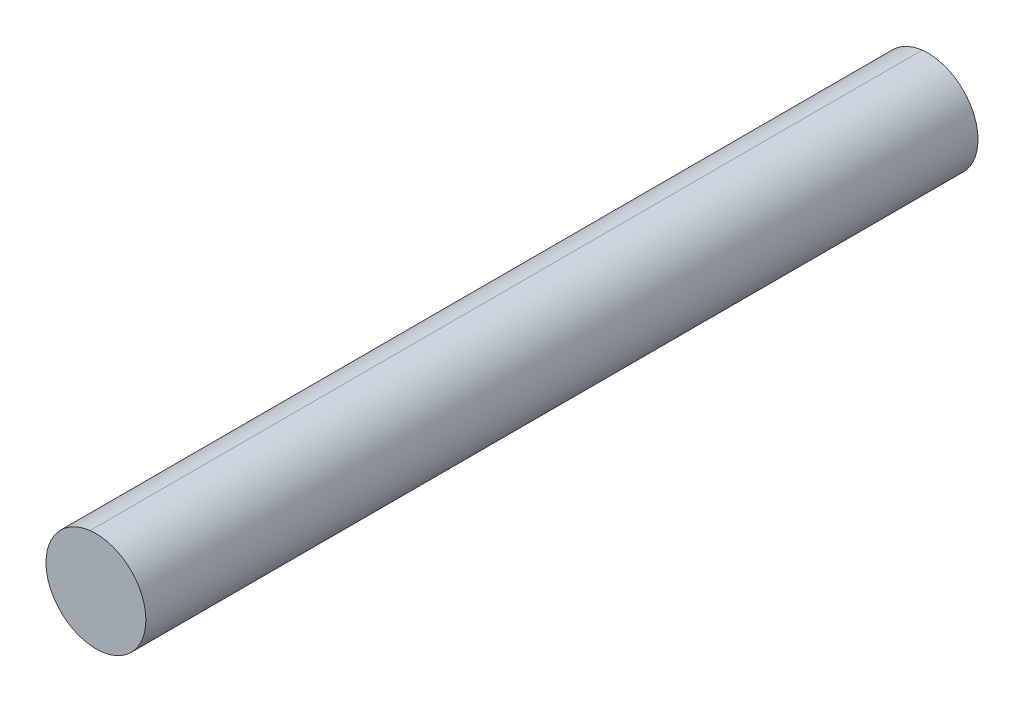
ISO-10303-21;
HEADER;
FILE_DESCRIPTION(('STEP AP214'),'2;1');
FILE_NAME('part.step','',(''),(''),'','','');
FILE_SCHEMA(('AUTOMOTIVE_DESIGN { 1 0 10303 214 1 1 1 1 }'));
ENDSEC;
DATA;
#1=APPLICATION_CONTEXT('core data for automotive mechanical design processes');
#2=APPLICATION_PROTOCOL_DEFINITION('international standard','automotive_design',2000,#1);
#3=PRODUCT_CONTEXT('',#1,'mechanical');
#4=PRODUCT('Part','Part','',(#3));
#5=PRODUCT_RELATED_PRODUCT_CATEGORY('part','',(#4));
#6=PRODUCT_DEFINITION_FORMATION('','',#4);
#7=PRODUCT_DEFINITION_CONTEXT('part definition',#1,'design');
#8=PRODUCT_DEFINITION('design','',#6,#7);
#9=PRODUCT_DEFINITION_SHAPE('','',#8);
#10=(LENGTH_UNIT() NAMED_UNIT(*) SI_UNIT(.MILLI.,.METRE.));
#11=(NAMED_UNIT(*) PLANE_ANGLE_UNIT() SI_UNIT($,.RADIAN.));
#12=(NAMED_UNIT(*) SI_UNIT($,.STERADIAN.) SOLID_ANGLE_UNIT());
#13=UNCERTAINTY_MEASURE_WITH_UNIT(LENGTH_MEASURE(1.E-05),#10,'distance_accuracy_value','');
#14=(GEOMETRIC_REPRESENTATION_CONTEXT(3) GLOBAL_UNCERTAINTY_ASSIGNED_CONTEXT((#13)) GLOBAL_UNIT_ASSIGNED_CONTEXT((#10,
#11,#12)) REPRESENTATION_CONTEXT('',''));
#15=CARTESIAN_POINT('',(0.,0.,0.));
#16=DIRECTION('',(0.,0.,1.));
#17=DIRECTION('',(1.,0.,0.));
#18=AXIS2_PLACEMENT_3D('',#15,#16,#17);
#19=CARTESIAN_POINT('',(-1.50424744913924,-1.51311042144572,24.999985));
#20=CARTESIAN_POINT('',(-1.50424744913924,1.51735191246717,24.999985));
#21=CARTESIAN_POINT('',(1.50454946776159,-1.51311042144572,24.999985));
#22=CARTESIAN_POINT('',(1.50454946776159,1.51735191246717,24.999985));
#23=(BOUNDED_SURFACE() B_SPLINE_SURFACE(1,1,((#19,#20),(#21,#22)),.UNSPECIFIED.,.F.,.F.,
.F.) B_SPLINE_SURFACE_WITH_KNOTS((2,2),(2,2),(0.145602545046179,3.15439946194701),
(0.136703064072907,3.1671653979858),
.UNSPECIFIED.) GEOMETRIC_REPRESENTATION_ITEM() RATIONAL_B_SPLINE_SURFACE(((1.,1.),(1.,1.))) REPRESENTATION_ITEM('') SURFACE());
#24=CARTESIAN_POINT('',(0.091572809386774,-1.49720219762763,24.999985));
#25=CARTESIAN_POINT('',(0.045829145032609,-1.5,24.999985));
#26=CARTESIAN_POINT('',(0.,-1.5,24.999985));
#27=CARTESIAN_POINT('',(-1.5,-1.5,24.999985));
#28=CARTESIAN_POINT('',(-1.5,0.,24.999985));
#29=(BOUNDED_CURVE() B_SPLINE_CURVE(2,(#24,#25,#26,#27,#28),.UNSPECIFIED.,.F.,
.F.) B_SPLINE_CURVE_WITH_KNOTS((3,2,3),(0.739332962222494,0.75,1.),
.UNSPECIFIED.) CURVE() GEOMETRIC_REPRESENTATION_ITEM() RATIONAL_B_SPLINE_CURVE((0.976072041631465,
0.987502787880567,1.,0.707106781186548,1.)) REPRESENTATION_ITEM(''));
#30=CARTESIAN_POINT('',(0.091572809386774,-1.49720219762763,24.999985));
#31=VERTEX_POINT('',#30);
#32=CARTESIAN_POINT('',(-1.5,0.,24.999985));
#33=VERTEX_POINT('',#32);
#34=EDGE_CURVE('E22',#31,#33,#29,.T.);
#35=CARTESIAN_POINT('',(1.5,0.,24.999985));
#36=CARTESIAN_POINT('',(1.5,-1.41105910019899,24.999985));
#37=CARTESIAN_POINT('',(0.091572809386774,-1.49720219762763,24.999985));
#38=(BOUNDED_CURVE() B_SPLINE_CURVE(2,(#35,#36,#37),.UNSPECIFIED.,.F.,
.F.) B_SPLINE_CURVE_WITH_KNOTS((3,3),(0.5,0.739332962222494),
.UNSPECIFIED.) CURVE() GEOMETRIC_REPRESENTATION_ITEM() RATIONAL_B_SPLINE_CURVE((1.,
0.719603993305982,0.976072041631464)) REPRESENTATION_ITEM(''));
#39=CARTESIAN_POINT('',(1.5,0.,24.999985));
#40=VERTEX_POINT('',#39);
#41=EDGE_CURVE('E106',#40,#31,#38,.T.);
#42=CARTESIAN_POINT('',(-0.177051352010474,1.48951428954249,24.999985));
#43=CARTESIAN_POINT('',(-0.088836179503469,1.5,24.999985));
#44=CARTESIAN_POINT('',(0.,1.5,24.999985));
#45=CARTESIAN_POINT('',(1.5,1.5,24.999985));
#46=CARTESIAN_POINT('',(1.5,0.,24.999985));
#47=(BOUNDED_CURVE() B_SPLINE_CURVE(2,(#42,#43,#44,#45,#46),.UNSPECIFIED.,.F.,
.F.) B_SPLINE_CURVE_WITH_KNOTS((3,2,3),(0.229562473509895,0.25,0.5),
.UNSPECIFIED.) CURVE() GEOMETRIC_REPRESENTATION_ITEM() RATIONAL_B_SPLINE_CURVE((0.956026754176617,
0.976055948326912,1.,0.707106781186548,1.)) REPRESENTATION_ITEM(''));
#48=CARTESIAN_POINT('',(-0.177051352010474,1.48951428954249,24.999985));
#49=VERTEX_POINT('',#48);
#50=EDGE_CURVE('E93',#49,#40,#47,.T.);
#51=CARTESIAN_POINT('',(-1.5,0.,24.999985));
#52=CARTESIAN_POINT('',(-1.5,1.33226178888141,24.999985));
#53=CARTESIAN_POINT('',(-0.177051352010474,1.48951428954249,24.999985));
#54=(BOUNDED_CURVE() B_SPLINE_CURVE(2,(#51,#52,#53),.UNSPECIFIED.,.F.,
.F.) B_SPLINE_CURVE_WITH_KNOTS((3,3),(0.,0.229562473509895),
.UNSPECIFIED.) CURVE() GEOMETRIC_REPRESENTATION_ITEM() RATIONAL_B_SPLINE_CURVE((1.,
0.731050832859636,0.956026754176617)) REPRESENTATION_ITEM(''));
#55=EDGE_CURVE('E11',#33,#49,#54,.T.);
#56=ORIENTED_EDGE('',*,*,#34,.F.);
#57=ORIENTED_EDGE('',*,*,#41,.F.);
#58=ORIENTED_EDGE('',*,*,#50,.F.);
#59=ORIENTED_EDGE('',*,*,#55,.F.);
#60=EDGE_LOOP('',(#56,#57,#58,#59));
#61=FACE_BOUND('',#60,.T.);
#62=ADVANCED_FACE('F16',(#61),#23,.T.);
#63=CARTESIAN_POINT('',(1.50454946776159,-1.51311042144572,0.));
#64=CARTESIAN_POINT('',(1.50454946776159,1.51735191246717,0.));
#65=CARTESIAN_POINT('',(-1.50424744913924,-1.51311042144572,0.));
#66=CARTESIAN_POINT('',(-1.50424744913924,1.51735191246717,0.));
#67=(BOUNDED_SURFACE() B_SPLINE_SURFACE(1,1,((#63,#64),(#65,#66)),.UNSPECIFIED.,.F.,.F.,
.F.) B_SPLINE_SURFACE_WITH_KNOTS((2,2),(2,2),(0.145300526423826,3.15409744332466),
(0.136703064072906,3.1671653979858),
.UNSPECIFIED.) GEOMETRIC_REPRESENTATION_ITEM() RATIONAL_B_SPLINE_SURFACE(((1.,1.),(1.,1.))) REPRESENTATION_ITEM('') SURFACE());
#68=CARTESIAN_POINT('',(-1.5,0.,0.));
#69=CARTESIAN_POINT('',(-1.5,1.33226178888141,0.));
#70=CARTESIAN_POINT('',(-0.177051352010473,1.48951428954249,0.));
#71=(BOUNDED_CURVE() B_SPLINE_CURVE(2,(#68,#69,#70),.UNSPECIFIED.,.F.,
.F.) B_SPLINE_CURVE_WITH_KNOTS((3,3),(0.,0.229562473509895),
.UNSPECIFIED.) CURVE() GEOMETRIC_REPRESENTATION_ITEM() RATIONAL_B_SPLINE_CURVE((1.,
0.731050832859636,0.956026754176617)) REPRESENTATION_ITEM(''));
#72=CARTESIAN_POINT('',(-1.5,0.,0.));
#73=VERTEX_POINT('',#72);
#74=CARTESIAN_POINT('',(-0.177051352010473,1.48951428954249,0.));
#75=VERTEX_POINT('',#74);
#76=EDGE_CURVE('E84',#73,#75,#71,.T.);
#77=CARTESIAN_POINT('',(-0.177051352010473,1.48951428954249,0.));
#78=CARTESIAN_POINT('',(-0.088836179503469,1.5,0.));
#79=CARTESIAN_POINT('',(0.,1.5,0.));
#80=CARTESIAN_POINT('',(1.5,1.5,0.));
#81=CARTESIAN_POINT('',(1.5,0.,0.));
#82=(BOUNDED_CURVE() B_SPLINE_CURVE(2,(#77,#78,#79,#80,#81),.UNSPECIFIED.,.F.,
.F.) B_SPLINE_CURVE_WITH_KNOTS((3,2,3),(0.229562473509895,0.25,0.5),
.UNSPECIFIED.) CURVE() GEOMETRIC_REPRESENTATION_ITEM() RATIONAL_B_SPLINE_CURVE((0.956026754176617,
0.976055948326912,1.,0.707106781186548,1.)) REPRESENTATION_ITEM(''));
#83=CARTESIAN_POINT('',(1.5,0.,0.));
#84=VERTEX_POINT('',#83);
#85=EDGE_CURVE('E79',#75,#84,#82,.T.);
#86=CARTESIAN_POINT('',(1.5,0.,0.));
#87=CARTESIAN_POINT('',(1.5,-1.41105910019899,0.));
#88=CARTESIAN_POINT('',(0.091572809386774,-1.49720219762763,0.));
#89=(BOUNDED_CURVE() B_SPLINE_CURVE(2,(#86,#87,#88),.UNSPECIFIED.,.F.,
.F.) B_SPLINE_CURVE_WITH_KNOTS((3,3),(0.5,0.739332962222494),
.UNSPECIFIED.) CURVE() GEOMETRIC_REPRESENTATION_ITEM() RATIONAL_B_SPLINE_CURVE((1.,
0.719603993305982,0.976072041631464)) REPRESENTATION_ITEM(''));
#90=CARTESIAN_POINT('',(0.091572809386774,-1.49720219762763,0.));
#91=VERTEX_POINT('',#90);
#92=EDGE_CURVE('E75',#84,#91,#89,.T.);
#93=CARTESIAN_POINT('',(0.091572809386774,-1.49720219762763,0.));
#94=CARTESIAN_POINT('',(0.045829145032609,-1.5,0.));
#95=CARTESIAN_POINT('',(0.,-1.5,0.));
#96=CARTESIAN_POINT('',(-1.5,-1.5,0.));
#97=CARTESIAN_POINT('',(-1.5,0.,0.));
#98=(BOUNDED_CURVE() B_SPLINE_CURVE(2,(#93,#94,#95,#96,#97),.UNSPECIFIED.,.F.,
.F.) B_SPLINE_CURVE_WITH_KNOTS((3,2,3),(0.739332962222494,0.75,1.),
.UNSPECIFIED.) CURVE() GEOMETRIC_REPRESENTATION_ITEM() RATIONAL_B_SPLINE_CURVE((0.976072041631465,
0.987502787880567,1.,0.707106781186548,1.)) REPRESENTATION_ITEM(''));
#99=EDGE_CURVE('E53',#91,#73,#98,.T.);
#100=ORIENTED_EDGE('',*,*,#76,.T.);
#101=ORIENTED_EDGE('',*,*,#85,.T.);
#102=ORIENTED_EDGE('',*,*,#92,.T.);
#103=ORIENTED_EDGE('',*,*,#99,.T.);
#104=EDGE_LOOP('',(#100,#101,#102,#103));
#105=FACE_BOUND('',#104,.T.);
#106=ADVANCED_FACE('F86',(#105),#67,.T.);
#107=CARTESIAN_POINT('',(0.091572809302285,-1.4972021976328,25.009985));
#108=CARTESIAN_POINT('',(0.091572809302285,-1.4972021976328,-0.0100000000000042));
#109=CARTESIAN_POINT('',(-1.40562938833052,-1.58877500693509,25.009985));
#110=CARTESIAN_POINT('',(-1.40562938833052,-1.58877500693509,-0.010000000000007));
#111=CARTESIAN_POINT('',(-1.4972021976328,-0.091572809302285,25.009985));
#112=CARTESIAN_POINT('',(-1.4972021976328,-0.091572809302285,-0.0100000000000042));
#113=CARTESIAN_POINT('',(-1.58367929509879,1.32231523625925,25.009985));
#114=CARTESIAN_POINT('',(-1.58367929509879,1.32231523625925,-0.0100000000000042));
#115=CARTESIAN_POINT('',(-0.177051351985138,1.4895142895455,25.009985));
#116=CARTESIAN_POINT('',(-0.177051351985138,1.4895142895455,-0.0100000000000041));
#117=(BOUNDED_SURFACE() B_SPLINE_SURFACE(2,1,((#107,#108),(#109,#110),(#111,#112),(#113,#114),
(#115,#116)),.UNSPECIFIED.,.F.,.F.,.F.) B_SPLINE_SURFACE_WITH_KNOTS((3,2,3),(2,2),(0.,
1.5707963267949,3.07876080051799),(0.614999624999996,25.634984625),
.UNSPECIFIED.) GEOMETRIC_REPRESENTATION_ITEM() RATIONAL_B_SPLINE_SURFACE(((1.,1.),
(0.707106781186548,0.707106781186548),(1.,1.),(0.718822509939086,0.718822509939086),
(0.977505800795127,0.977505800795127))) REPRESENTATION_ITEM('') SURFACE());
#118=CARTESIAN_POINT('',(0.091572809386774,-1.49720219762763,24.999985));
#119=CARTESIAN_POINT('',(0.091572809386774,-1.49720219762763,0.));
#120=(BOUNDED_CURVE() B_SPLINE_CURVE(1,(#118,#119),.UNSPECIFIED.,.F.,
.F.) B_SPLINE_CURVE_WITH_KNOTS((2,2),(0.,1.),
.UNSPECIFIED.) CURVE() GEOMETRIC_REPRESENTATION_ITEM() RATIONAL_B_SPLINE_CURVE((1.,1.)) REPRESENTATION_ITEM(''));
#121=EDGE_CURVE('E82',#31,#91,#120,.T.);
#122=CARTESIAN_POINT('',(-0.177051352010474,1.48951428954249,24.999985));
#123=CARTESIAN_POINT('',(-0.177051352010473,1.48951428954249,0.));
#124=(BOUNDED_CURVE() B_SPLINE_CURVE(1,(#122,#123),.UNSPECIFIED.,.F.,
.F.) B_SPLINE_CURVE_WITH_KNOTS((2,2),(0.,1.),
.UNSPECIFIED.) CURVE() GEOMETRIC_REPRESENTATION_ITEM() RATIONAL_B_SPLINE_CURVE((1.,1.)) REPRESENTATION_ITEM(''));
#125=EDGE_CURVE('E88',#49,#75,#124,.T.);
#126=ORIENTED_EDGE('',*,*,#76,.F.);
#127=ORIENTED_EDGE('',*,*,#99,.F.);
#128=ORIENTED_EDGE('',*,*,#121,.F.);
#129=ORIENTED_EDGE('',*,*,#34,.T.);
#130=ORIENTED_EDGE('',*,*,#55,.T.);
#131=ORIENTED_EDGE('',*,*,#125,.T.);
#132=EDGE_LOOP('',(#126,#127,#128,#129,#130,#131));
#133=FACE_BOUND('',#132,.T.);
#134=ADVANCED_FACE('F18',(#133),#117,.T.);
#135=CARTESIAN_POINT('',(-0.177051351985138,1.4895142895455,25.009985));
#136=CARTESIAN_POINT('',(-0.177051351985138,1.4895142895455,-0.0100000000000041));
#137=CARTESIAN_POINT('',(-0.134422092956966,1.49458142317291,25.009985));
#138=CARTESIAN_POINT('',(-0.134422092956966,1.49458142317291,-0.010000000000004));
#139=CARTESIAN_POINT('',(-0.091572809302285,1.4972021976328,25.009985));
#140=CARTESIAN_POINT('',(-0.091572809302285,1.4972021976328,-0.0100000000000042));
#141=CARTESIAN_POINT('',(1.40562938833052,1.58877500693509,25.009985));
#142=CARTESIAN_POINT('',(1.40562938833052,1.58877500693509,-0.010000000000007));
#143=CARTESIAN_POINT('',(1.4972021976328,0.091572809302285,25.009985));
#144=CARTESIAN_POINT('',(1.4972021976328,0.091572809302285,-0.0100000000000042));
#145=CARTESIAN_POINT('',(1.58877500693509,-1.40562938833052,25.009985));
#146=CARTESIAN_POINT('',(1.58877500693509,-1.40562938833052,-0.010000000000007));
#147=CARTESIAN_POINT('',(0.091572809302285,-1.4972021976328,25.009985));
#148=CARTESIAN_POINT('',(0.091572809302285,-1.4972021976328,-0.0100000000000042));
#149=(BOUNDED_SURFACE() B_SPLINE_SURFACE(2,1,((#135,#136),(#137,#138),(#139,#140),(#141,#142),
(#143,#144),(#145,#146),(#147,#148)),.UNSPECIFIED.,.F.,.F.,.F.) B_SPLINE_SURFACE_WITH_KNOTS((3,
2,2,3),(2,2),(3.07876080051799,3.1415926535898,4.71238898038469,6.28318530717959),
(0.614999624999994,25.634984625),
.UNSPECIFIED.) GEOMETRIC_REPRESENTATION_ITEM() RATIONAL_B_SPLINE_SURFACE(((0.977505800795127,
0.977505800795127),(0.988284271247462,0.988284271247462),(1.,1.),(0.707106781186548,
0.707106781186548),(1.,1.),(0.707106781186548,0.707106781186548),(1.,1.))) REPRESENTATION_ITEM('') SURFACE());
#150=ORIENTED_EDGE('',*,*,#85,.F.);
#151=ORIENTED_EDGE('',*,*,#125,.F.);
#152=ORIENTED_EDGE('',*,*,#50,.T.);
#153=ORIENTED_EDGE('',*,*,#41,.T.);
#154=ORIENTED_EDGE('',*,*,#121,.T.);
#155=ORIENTED_EDGE('',*,*,#92,.F.);
#156=EDGE_LOOP('',(#150,#151,#152,#153,#154,#155));
#157=FACE_BOUND('',#156,.T.);
#158=ADVANCED_FACE('F77',(#157),#149,.T.);
#159=CLOSED_SHELL('',(#62,#106,#134,#158));
#160=MANIFOLD_SOLID_BREP('B1',#159);
#161=ADVANCED_BREP_SHAPE_REPRESENTATION('',(#18,#160),#14);
#162=SHAPE_DEFINITION_REPRESENTATION(#9,#161);
ENDSEC;
END-ISO-10303-21;
